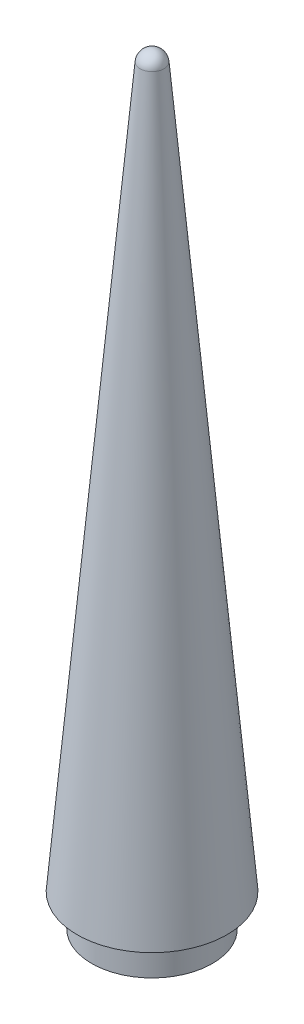
ISO-10303-21;
HEADER;
FILE_DESCRIPTION(('STEP AP214'),'2;1');
FILE_NAME('part.step','',(''),(''),'','','');
FILE_SCHEMA(('AUTOMOTIVE_DESIGN { 1 0 10303 214 1 1 1 1 }'));
ENDSEC;
DATA;
#1=APPLICATION_CONTEXT('core data for automotive mechanical design processes');
#2=APPLICATION_PROTOCOL_DEFINITION('international standard','automotive_design',2000,#1);
#3=PRODUCT_CONTEXT('',#1,'mechanical');
#4=PRODUCT('Part','Part','',(#3));
#5=PRODUCT_RELATED_PRODUCT_CATEGORY('part','',(#4));
#6=PRODUCT_DEFINITION_FORMATION('','',#4);
#7=PRODUCT_DEFINITION_CONTEXT('part definition',#1,'design');
#8=PRODUCT_DEFINITION('design','',#6,#7);
#9=PRODUCT_DEFINITION_SHAPE('','',#8);
#10=(LENGTH_UNIT() NAMED_UNIT(*) SI_UNIT(.MILLI.,.METRE.));
#11=(NAMED_UNIT(*) PLANE_ANGLE_UNIT() SI_UNIT($,.RADIAN.));
#12=(NAMED_UNIT(*) SI_UNIT($,.STERADIAN.) SOLID_ANGLE_UNIT());
#13=UNCERTAINTY_MEASURE_WITH_UNIT(LENGTH_MEASURE(1.E-05),#10,'distance_accuracy_value','');
#14=(GEOMETRIC_REPRESENTATION_CONTEXT(3) GLOBAL_UNCERTAINTY_ASSIGNED_CONTEXT((#13)) GLOBAL_UNIT_ASSIGNED_CONTEXT((#10,
#11,#12)) REPRESENTATION_CONTEXT('',''));
#15=CARTESIAN_POINT('',(0.,0.,0.));
#16=DIRECTION('',(0.,0.,1.));
#17=DIRECTION('',(1.,0.,0.));
#18=AXIS2_PLACEMENT_3D('',#15,#16,#17);
#19=CARTESIAN_POINT('',(0.,119.881798926861,0.));
#20=DIRECTION('',(0.,-1.,0.));
#21=DIRECTION('',(0.,0.,-1.));
#22=AXIS2_PLACEMENT_3D('',#19,#20,#21);
#23=CONICAL_SURFACE('',#22,1.89775089986478,0.0872664625997099);
#24=CARTESIAN_POINT('',(0.,6.47303430651625,0.));
#25=DIRECTION('',(0.,-1.,0.));
#26=DIRECTION('',(0.,0.,-1.));
#27=AXIS2_PLACEMENT_3D('',#24,#25,#26);
#28=CIRCLE('',#27,11.8197321486241);
#29=CARTESIAN_POINT('',(0.,6.47303430651626,-11.8197321486241));
#30=VERTEX_POINT('',#29);
#31=EDGE_CURVE('E72',#30,#30,#28,.T.);
#32=CARTESIAN_POINT('',(0.,119.881798926861,0.));
#33=DIRECTION('',(0.,-1.,0.));
#34=DIRECTION('',(0.,0.,-1.));
#35=AXIS2_PLACEMENT_3D('',#32,#33,#34);
#36=CIRCLE('',#35,1.89775089986478);
#37=CARTESIAN_POINT('',(0.,119.881798926861,-1.89775089986478));
#38=VERTEX_POINT('',#37);
#39=EDGE_CURVE('E11',#38,#38,#36,.T.);
#40=CARTESIAN_POINT('',(0.,6.47303430651626,-11.8197321486241));
#41=CARTESIAN_POINT('',(0.,7.65437560464485,-11.7163781772828));
#42=CARTESIAN_POINT('',(0.,8.83571690277345,-11.6130242059416));
#43=CARTESIAN_POINT('',(0.,11.1983994990306,-11.4063162632591));
#44=CARTESIAN_POINT('',(0.,12.3797407971592,-11.3029622919179));
#45=CARTESIAN_POINT('',(0.,14.7424233934164,-11.0962543492354));
#46=CARTESIAN_POINT('',(0.,15.923764691545,-10.9929003778942));
#47=CARTESIAN_POINT('',(0.,18.2864472878022,-10.7861924352117));
#48=CARTESIAN_POINT('',(0.,19.4677885859308,-10.6828384638704));
#49=CARTESIAN_POINT('',(0.,21.830471182188,-10.4761305211879));
#50=CARTESIAN_POINT('',(0.,23.0118124803166,-10.3727765498467));
#51=CARTESIAN_POINT('',(0.,25.3744950765737,-10.1660686071642));
#52=CARTESIAN_POINT('',(0.,26.5558363747023,-10.062714635823));
#53=CARTESIAN_POINT('',(0.,28.9185189709595,-9.85600669314048));
#54=CARTESIAN_POINT('',(0.,30.0998602690881,-9.75265272179923));
#55=CARTESIAN_POINT('',(0.,32.4625428653453,-9.54594477911675));
#56=CARTESIAN_POINT('',(0.,33.6438841634739,-9.4425908077755));
#57=CARTESIAN_POINT('',(0.,36.0065667597311,-9.23588286509302));
#58=CARTESIAN_POINT('',(0.,37.1879080578597,-9.13252889375178));
#59=CARTESIAN_POINT('',(0.,39.5505906541169,-8.92582095106929));
#60=CARTESIAN_POINT('',(0.,40.7319319522455,-8.82246697972805));
#61=CARTESIAN_POINT('',(0.,43.0946145485026,-8.61575903704556));
#62=CARTESIAN_POINT('',(0.,44.2759558466312,-8.51240506570432));
#63=CARTESIAN_POINT('',(0.,46.6386384428884,-8.30569712302183));
#64=CARTESIAN_POINT('',(0.,47.819979741017,-8.20234315168059));
#65=CARTESIAN_POINT('',(0.,50.1826623372742,-7.99563520899811));
#66=CARTESIAN_POINT('',(0.,51.3640036354028,-7.89228123765686));
#67=CARTESIAN_POINT('',(0.,53.72668623166,-7.68557329497438));
#68=CARTESIAN_POINT('',(0.,54.9080275297886,-7.58221932363313));
#69=CARTESIAN_POINT('',(0.,57.2707101260458,-7.37551138095065));
#70=CARTESIAN_POINT('',(0.,58.4520514241743,-7.27215740960941));
#71=CARTESIAN_POINT('',(0.,60.8147340204315,-7.06544946692692));
#72=CARTESIAN_POINT('',(0.,61.9960753185601,-6.96209549558568));
#73=CARTESIAN_POINT('',(0.,64.3587579148173,-6.75538755290319));
#74=CARTESIAN_POINT('',(0.,65.5400992129459,-6.65203358156195));
#75=CARTESIAN_POINT('',(0.,67.9027818092031,-6.44532563887946));
#76=CARTESIAN_POINT('',(0.,69.0841231073317,-6.34197166753822));
#77=CARTESIAN_POINT('',(0.,71.4468057035889,-6.13526372485574));
#78=CARTESIAN_POINT('',(0.,72.6281470017175,-6.03190975351449));
#79=CARTESIAN_POINT('',(0.,74.9908295979747,-5.82520181083201));
#80=CARTESIAN_POINT('',(0.,76.1721708961032,-5.72184783949076));
#81=CARTESIAN_POINT('',(0.,78.5348534923604,-5.51513989680828));
#82=CARTESIAN_POINT('',(0.,79.716194790489,-5.41178592546703));
#83=CARTESIAN_POINT('',(0.,82.0788773867462,-5.20507798278455));
#84=CARTESIAN_POINT('',(0.,83.2602186848748,-5.10172401144331));
#85=CARTESIAN_POINT('',(0.,85.622901281132,-4.89501606876082));
#86=CARTESIAN_POINT('',(0.,86.8042425792606,-4.79166209741958));
#87=CARTESIAN_POINT('',(0.,89.1669251755178,-4.58495415473709));
#88=CARTESIAN_POINT('',(0.,90.3482664736464,-4.48160018339585));
#89=CARTESIAN_POINT('',(0.,92.7109490699035,-4.27489224071336));
#90=CARTESIAN_POINT('',(0.,93.8922903680321,-4.17153826937212));
#91=CARTESIAN_POINT('',(0.,96.2549729642893,-3.96483032668963));
#92=CARTESIAN_POINT('',(0.,97.4363142624179,-3.86147635534839));
#93=CARTESIAN_POINT('',(0.,99.7989968586751,-3.65476841266591));
#94=CARTESIAN_POINT('',(0.,100.980338156804,-3.55141444132466));
#95=CARTESIAN_POINT('',(0.,103.343020753061,-3.34470649864218));
#96=CARTESIAN_POINT('',(0.,104.524362051189,-3.24135252730093));
#97=CARTESIAN_POINT('',(0.,106.887044647447,-3.03464458461845));
#98=CARTESIAN_POINT('',(0.,108.068385945575,-2.93129061327721));
#99=CARTESIAN_POINT('',(0.,110.431068541832,-2.72458267059472));
#100=CARTESIAN_POINT('',(0.,111.612409839961,-2.62122869925348));
#101=CARTESIAN_POINT('',(0.,113.975092436218,-2.41452075657099));
#102=CARTESIAN_POINT('',(0.,115.156433734347,-2.31116678522975));
#103=CARTESIAN_POINT('',(0.,117.519116330604,-2.10445884254726));
#104=CARTESIAN_POINT('',(0.,118.700457628733,-2.00110487120602));
#105=CARTESIAN_POINT('',(0.,119.881798926861,-1.89775089986478));
#106=B_SPLINE_CURVE_WITH_KNOTS('',3,(#40,#41,#42,#43,#44,#45,#46,#47,#48,#49,#50,#51,#52,#53,
#54,#55,#56,#57,#58,#59,#60,#61,#62,#63,#64,#65,#66,#67,#68,#69,#70,#71,#72,#73,#74,#75,#76,#77,
#78,#79,#80,#81,#82,#83,#84,#85,#86,#87,#88,#89,#90,#91,#92,#93,#94,#95,#96,#97,#98,#99,#100,
#101,#102,#103,#104,#105),.UNSPECIFIED.,.F.,.F.,(4,2,2,2,2,2,2,2,2,2,2,2,2,2,2,2,2,2,2,2,2,2,2,
2,2,2,2,2,2,2,2,2,4),(0.,3.55756148991207,7.11512297982415,10.6726844697362,14.2302459596483,
17.7878074495604,21.3453689394724,24.9029304293845,28.4604919192966,32.0180534092086,
35.5756148991207,39.1331763890328,42.6907378789449,46.2482993688569,49.805860858769,
53.3634223486811,56.9209838385932,60.4785453285053,64.0361068184173,67.5936683083294,
71.1512297982415,74.7087912881535,78.2663527780656,81.8239142679777,85.3814757578897,
88.9390372478018,92.4965987377139,96.0541602276259,99.611721717538,103.16928320745,
106.726844697362,110.284406187274,113.841967677186),.UNSPECIFIED.);
#107=EDGE_CURVE('BSEAM51',#30,#38,#106,.T.);
#108=ORIENTED_EDGE('',*,*,#31,.F.);
#109=ORIENTED_EDGE('',*,*,#39,.T.);
#110=ORIENTED_EDGE('',*,*,#107,.T.);
#111=ORIENTED_EDGE('',*,*,#107,.F.);
#112=EDGE_LOOP('',(#108,#110,#109,#111));
#113=FACE_BOUND('',#112,.T.);
#114=ADVANCED_FACE('F51',(#113),#23,.T.);
#115=CARTESIAN_POINT('',(0.,119.715767236927,0.));
#116=DIRECTION('',(0.,-1.,0.));
#117=DIRECTION('',(1.,0.,0.));
#118=AXIS2_PLACEMENT_3D('',#115,#116,#117);
#119=SPHERICAL_SURFACE('',#118,1.905);
#120=ORIENTED_EDGE('',*,*,#39,.F.);
#121=EDGE_LOOP('',(#120));
#122=FACE_BOUND('',#121,.T.);
#123=ADVANCED_FACE('F106',(#122),#119,.T.);
#124=CARTESIAN_POINT('',(0.,1.39303430651627,0.));
#125=DIRECTION('',(0.,1.,0.));
#126=DIRECTION('',(0.,0.,1.));
#127=AXIS2_PLACEMENT_3D('',#124,#125,#126);
#128=PLANE('',#127);
#129=CARTESIAN_POINT('',(0.,1.39303430651627,0.));
#130=DIRECTION('',(0.,-1.,0.));
#131=DIRECTION('',(0.,0.,-1.));
#132=AXIS2_PLACEMENT_3D('',#129,#130,#131);
#133=CIRCLE('',#132,3.81);
#134=CARTESIAN_POINT('',(0.,1.39303430651627,-3.81));
#135=VERTEX_POINT('',#134);
#136=EDGE_CURVE('E81',#135,#135,#133,.T.);
#137=ORIENTED_EDGE('',*,*,#136,.F.);
#138=EDGE_LOOP('',(#137));
#139=FACE_BOUND('',#138,.T.);
#140=CARTESIAN_POINT('',(0.,1.39303430651627,0.));
#141=DIRECTION('',(0.,-1.,0.));
#142=DIRECTION('',(0.,0.,-1.));
#143=AXIS2_PLACEMENT_3D('',#140,#141,#142);
#144=CIRCLE('',#143,9.525);
#145=CARTESIAN_POINT('',(0.,1.39303430651627,-9.525));
#146=VERTEX_POINT('',#145);
#147=EDGE_CURVE('E58',#146,#146,#144,.T.);
#148=ORIENTED_EDGE('',*,*,#147,.T.);
#149=EDGE_LOOP('',(#148));
#150=FACE_BOUND('',#149,.T.);
#151=ADVANCED_FACE('F91',(#139,#150),#128,.F.);
#152=CARTESIAN_POINT('',(0.,6.47303430651627,0.));
#153=DIRECTION('',(0.,-1.,0.));
#154=DIRECTION('',(0.,0.,-1.));
#155=AXIS2_PLACEMENT_3D('',#152,#153,#154);
#156=CYLINDRICAL_SURFACE('',#155,9.525);
#157=ORIENTED_EDGE('',*,*,#147,.F.);
#158=EDGE_LOOP('',(#157));
#159=FACE_BOUND('',#158,.T.);
#160=CARTESIAN_POINT('',(0.,6.47303430651627,0.));
#161=DIRECTION('',(0.,-1.,0.));
#162=DIRECTION('',(0.,0.,-1.));
#163=AXIS2_PLACEMENT_3D('',#160,#161,#162);
#164=CIRCLE('',#163,9.525);
#165=CARTESIAN_POINT('',(0.,6.47303430651627,-9.525));
#166=VERTEX_POINT('',#165);
#167=EDGE_CURVE('E78',#166,#166,#164,.T.);
#168=ORIENTED_EDGE('',*,*,#167,.T.);
#169=EDGE_LOOP('',(#168));
#170=FACE_BOUND('',#169,.T.);
#171=ADVANCED_FACE('F93',(#159,#170),#156,.T.);
#172=CARTESIAN_POINT('',(0.,6.47303430651626,0.));
#173=DIRECTION('',(0.,1.,0.));
#174=DIRECTION('',(0.,0.,1.));
#175=AXIS2_PLACEMENT_3D('',#172,#173,#174);
#176=PLANE('',#175);
#177=ORIENTED_EDGE('',*,*,#167,.F.);
#178=EDGE_LOOP('',(#177));
#179=FACE_BOUND('',#178,.T.);
#180=ORIENTED_EDGE('',*,*,#31,.T.);
#181=EDGE_LOOP('',(#180));
#182=FACE_BOUND('',#181,.T.);
#183=ADVANCED_FACE('F65',(#179,#182),#176,.F.);
#184=CARTESIAN_POINT('',(0.,64.8930343065163,0.));
#185=DIRECTION('',(0.,-1.,0.));
#186=DIRECTION('',(0.,0.,-1.));
#187=AXIS2_PLACEMENT_3D('',#184,#185,#186);
#188=CONICAL_SURFACE('',#187,2.55269999999999,1.02974425867665);
#189=CARTESIAN_POINT('',(0.,66.4268512087079,0.));
#190=VERTEX_POINT('',#189);
#191=VERTEX_LOOP('',#190);
#192=FACE_BOUND('',#191,.T.);
#193=CARTESIAN_POINT('',(0.,64.8930343065163,0.));
#194=DIRECTION('',(0.,-1.,0.));
#195=DIRECTION('',(0.,0.,-1.));
#196=AXIS2_PLACEMENT_3D('',#193,#194,#195);
#197=CIRCLE('',#196,2.55269999999999);
#198=CARTESIAN_POINT('',(0.,64.8930343065163,-2.55269999999999));
#199=VERTEX_POINT('',#198);
#200=EDGE_CURVE('E69',#199,#199,#197,.T.);
#201=ORIENTED_EDGE('',*,*,#200,.T.);
#202=EDGE_LOOP('',(#201));
#203=FACE_BOUND('',#202,.T.);
#204=ADVANCED_FACE('F61',(#192,#203),#188,.F.);
#205=CARTESIAN_POINT('',(0.,1.39303430651627,0.));
#206=DIRECTION('',(0.,-1.,0.));
#207=DIRECTION('',(0.,0.,-1.));
#208=AXIS2_PLACEMENT_3D('',#205,#206,#207);
#209=CYLINDRICAL_SURFACE('',#208,2.55269999999999);
#210=ORIENTED_EDGE('',*,*,#200,.F.);
#211=EDGE_LOOP('',(#210));
#212=FACE_BOUND('',#211,.T.);
#213=CARTESIAN_POINT('',(0.,2.65033430651627,0.));
#214=DIRECTION('',(0.,-1.,0.));
#215=DIRECTION('',(0.,0.,-1.));
#216=AXIS2_PLACEMENT_3D('',#213,#214,#215);
#217=CIRCLE('',#216,2.5527);
#218=CARTESIAN_POINT('',(0.,2.65033430651627,-2.5527));
#219=VERTEX_POINT('',#218);
#220=EDGE_CURVE('E73',#219,#219,#217,.T.);
#221=ORIENTED_EDGE('',*,*,#220,.T.);
#222=EDGE_LOOP('',(#221));
#223=FACE_BOUND('',#222,.T.);
#224=ADVANCED_FACE('F64',(#212,#223),#209,.F.);
#225=CARTESIAN_POINT('',(0.,1.39303430651627,0.));
#226=DIRECTION('',(0.,-1.,0.));
#227=DIRECTION('',(0.,0.,-1.));
#228=AXIS2_PLACEMENT_3D('',#225,#226,#227);
#229=CONICAL_SURFACE('',#228,3.81,0.785398163397448);
#230=ORIENTED_EDGE('',*,*,#220,.F.);
#231=EDGE_LOOP('',(#230));
#232=FACE_BOUND('',#231,.T.);
#233=ORIENTED_EDGE('',*,*,#136,.T.);
#234=EDGE_LOOP('',(#233));
#235=FACE_BOUND('',#234,.T.);
#236=ADVANCED_FACE('F118',(#232,#235),#229,.F.);
#237=CLOSED_SHELL('',(#114,#123,#151,#171,#183,#204,#224,#236));
#238=MANIFOLD_SOLID_BREP('B2',#237);
#239=ADVANCED_BREP_SHAPE_REPRESENTATION('',(#18,#238),#14);
#240=SHAPE_DEFINITION_REPRESENTATION(#9,#239);
ENDSEC;
END-ISO-10303-21;
